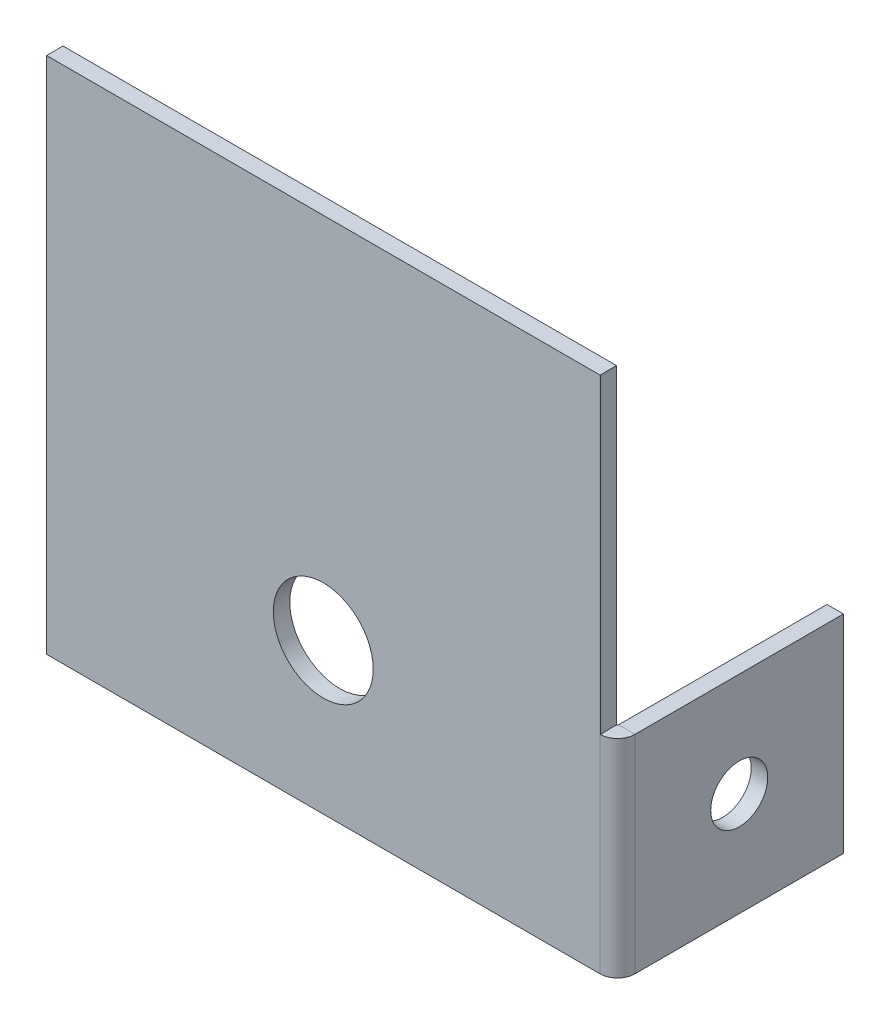
ISO-10303-21;
HEADER;
FILE_DESCRIPTION(('STEP AP214'),'2;1');
FILE_NAME('part.step','',(''),(''),'','','');
FILE_SCHEMA(('AUTOMOTIVE_DESIGN { 1 0 10303 214 1 1 1 1 }'));
ENDSEC;
DATA;
#1=APPLICATION_CONTEXT('core data for automotive mechanical design processes');
#2=APPLICATION_PROTOCOL_DEFINITION('international standard','automotive_design',2000,#1);
#3=PRODUCT_CONTEXT('',#1,'mechanical');
#4=PRODUCT('Part','Part','',(#3));
#5=PRODUCT_RELATED_PRODUCT_CATEGORY('part','',(#4));
#6=PRODUCT_DEFINITION_FORMATION('','',#4);
#7=PRODUCT_DEFINITION_CONTEXT('part definition',#1,'design');
#8=PRODUCT_DEFINITION('design','',#6,#7);
#9=PRODUCT_DEFINITION_SHAPE('','',#8);
#10=(LENGTH_UNIT() NAMED_UNIT(*) SI_UNIT(.MILLI.,.METRE.));
#11=(NAMED_UNIT(*) PLANE_ANGLE_UNIT() SI_UNIT($,.RADIAN.));
#12=(NAMED_UNIT(*) SI_UNIT($,.STERADIAN.) SOLID_ANGLE_UNIT());
#13=UNCERTAINTY_MEASURE_WITH_UNIT(LENGTH_MEASURE(1.E-05),#10,'distance_accuracy_value','');
#14=(GEOMETRIC_REPRESENTATION_CONTEXT(3) GLOBAL_UNCERTAINTY_ASSIGNED_CONTEXT((#13)) GLOBAL_UNIT_ASSIGNED_CONTEXT((#10,
#11,#12)) REPRESENTATION_CONTEXT('',''));
#15=CARTESIAN_POINT('',(0.,0.,0.));
#16=DIRECTION('',(0.,0.,1.));
#17=DIRECTION('',(1.,0.,0.));
#18=AXIS2_PLACEMENT_3D('',#15,#16,#17);
#19=CARTESIAN_POINT('',(26.7316212801133,-30.,8.2125));
#20=DIRECTION('',(0.,1.,0.));
#21=DIRECTION('',(1.,0.,0.));
#22=AXIS2_PLACEMENT_3D('',#19,#20,#21);
#23=PLANE('',#22);
#24=DIRECTION('',(0.,0.,1.));
#25=VECTOR('',#24,1.);
#26=CARTESIAN_POINT('',(26.7316212801133,-30.,8.2125));
#27=LINE('',#26,#25);
#28=CARTESIAN_POINT('',(26.7316212801132,-30.,-21.7875));
#29=VERTEX_POINT('',#28);
#30=CARTESIAN_POINT('',(26.7316212801132,-30.,-1.68749999999999));
#31=VERTEX_POINT('',#30);
#32=EDGE_CURVE('E194',#29,#31,#27,.T.);
#33=ORIENTED_EDGE('',*,*,#32,.T.);
#34=DIRECTION('',(1.,0.,0.));
#35=VECTOR('',#34,1.);
#36=CARTESIAN_POINT('',(26.7316212801132,-30.,-1.68749999999999));
#37=LINE('',#36,#35);
#38=CARTESIAN_POINT('',(28.3191212801132,-30.,-1.6875));
#39=VERTEX_POINT('',#38);
#40=EDGE_CURVE('E12',#31,#39,#37,.T.);
#41=ORIENTED_EDGE('',*,*,#40,.T.);
#42=DIRECTION('',(0.,0.,1.));
#43=VECTOR('',#42,1.);
#44=CARTESIAN_POINT('',(28.3191212801133,-30.,8.2125));
#45=LINE('',#44,#43);
#46=CARTESIAN_POINT('',(28.3191212801132,-30.,-21.7875));
#47=VERTEX_POINT('',#46);
#48=EDGE_CURVE('E59',#47,#39,#45,.T.);
#49=ORIENTED_EDGE('',*,*,#48,.F.);
#50=DIRECTION('',(1.,0.,0.));
#51=VECTOR('',#50,1.);
#52=CARTESIAN_POINT('',(26.7316212801132,-30.,-21.7875));
#53=LINE('',#52,#51);
#54=EDGE_CURVE('E198',#29,#47,#53,.T.);
#55=ORIENTED_EDGE('',*,*,#54,.F.);
#56=EDGE_LOOP('',(#33,#41,#49,#55));
#57=FACE_BOUND('',#56,.T.);
#58=ADVANCED_FACE('F43',(#57),#23,.T.);
#59=CARTESIAN_POINT('',(26.7316212801135,-50.,61.6757425602265));
#60=DIRECTION('',(0.,-1.,0.));
#61=DIRECTION('',(0.,0.,-1.));
#62=AXIS2_PLACEMENT_3D('',#59,#60,#61);
#63=PLANE('',#62);
#64=DIRECTION('',(0.,0.,-1.));
#65=VECTOR('',#64,1.);
#66=CARTESIAN_POINT('',(28.3191212801135,-50.,61.6757425602265));
#67=LINE('',#66,#65);
#68=CARTESIAN_POINT('',(28.3191212801132,-50.,-1.68750000000001));
#69=VERTEX_POINT('',#68);
#70=CARTESIAN_POINT('',(28.3191212801132,-50.,-21.7875));
#71=VERTEX_POINT('',#70);
#72=EDGE_CURVE('E66',#69,#71,#67,.T.);
#73=ORIENTED_EDGE('',*,*,#72,.F.);
#74=DIRECTION('',(-1.,0.,0.));
#75=VECTOR('',#74,1.);
#76=CARTESIAN_POINT('',(26.7316212801132,-50.,-1.6875));
#77=LINE('',#76,#75);
#78=CARTESIAN_POINT('',(26.7316212801132,-50.,-1.6875));
#79=VERTEX_POINT('',#78);
#80=EDGE_CURVE('E204',#69,#79,#77,.T.);
#81=ORIENTED_EDGE('',*,*,#80,.T.);
#82=DIRECTION('',(0.,0.,-1.));
#83=VECTOR('',#82,1.);
#84=CARTESIAN_POINT('',(26.7316212801135,-50.,61.6757425602265));
#85=LINE('',#84,#83);
#86=CARTESIAN_POINT('',(26.7316212801132,-50.,-21.7875));
#87=VERTEX_POINT('',#86);
#88=EDGE_CURVE('E195',#79,#87,#85,.T.);
#89=ORIENTED_EDGE('',*,*,#88,.T.);
#90=DIRECTION('',(1.,0.,0.));
#91=VECTOR('',#90,1.);
#92=CARTESIAN_POINT('',(26.7316212801132,-50.,-21.7875));
#93=LINE('',#92,#91);
#94=EDGE_CURVE('E201',#87,#71,#93,.T.);
#95=ORIENTED_EDGE('',*,*,#94,.T.);
#96=EDGE_LOOP('',(#73,#81,#89,#95));
#97=FACE_BOUND('',#96,.T.);
#98=ADVANCED_FACE('F212',(#97),#63,.T.);
#99=CARTESIAN_POINT('',(28.3191212801134,0.,34.9441212801132));
#100=DIRECTION('',(1.,0.,0.));
#101=DIRECTION('',(0.,0.,-1.));
#102=AXIS2_PLACEMENT_3D('',#99,#100,#101);
#103=PLANE('',#102);
#104=CARTESIAN_POINT('',(28.3191212801133,-40.,-11.7375));
#105=DIRECTION('',(-1.,0.,0.));
#106=DIRECTION('',(0.,0.,1.));
#107=AXIS2_PLACEMENT_3D('',#104,#105,#106);
#108=CIRCLE('',#107,2.75);
#109=CARTESIAN_POINT('',(28.3191212801133,-40.,-8.9875));
#110=VERTEX_POINT('',#109);
#111=EDGE_CURVE('E441',#110,#110,#108,.T.);
#112=ORIENTED_EDGE('',*,*,#111,.T.);
#113=EDGE_LOOP('',(#112));
#114=FACE_BOUND('',#113,.T.);
#115=ORIENTED_EDGE('',*,*,#48,.T.);
#116=DIRECTION('',(0.,-1.,0.));
#117=VECTOR('',#116,1.);
#118=CARTESIAN_POINT('',(28.3191212801132,0.,-1.68749999999999));
#119=LINE('',#118,#117);
#120=EDGE_CURVE('E51',#39,#69,#119,.T.);
#121=ORIENTED_EDGE('',*,*,#120,.T.);
#122=ORIENTED_EDGE('',*,*,#72,.T.);
#123=DIRECTION('',(0.,1.,0.));
#124=VECTOR('',#123,1.);
#125=CARTESIAN_POINT('',(28.3191212801132,-30.,-21.7875));
#126=LINE('',#125,#124);
#127=EDGE_CURVE('E196',#71,#47,#126,.T.);
#128=ORIENTED_EDGE('',*,*,#127,.T.);
#129=EDGE_LOOP('',(#115,#121,#122,#128));
#130=FACE_BOUND('',#129,.T.);
#131=ADVANCED_FACE('F223',(#114,#130),#103,.T.);
#132=CARTESIAN_POINT('',(26.7316212801132,-30.,-21.7875));
#133=DIRECTION('',(0.,0.,-1.));
#134=DIRECTION('',(-1.,0.,0.));
#135=AXIS2_PLACEMENT_3D('',#132,#133,#134);
#136=PLANE('',#135);
#137=ORIENTED_EDGE('',*,*,#127,.F.);
#138=ORIENTED_EDGE('',*,*,#94,.F.);
#139=DIRECTION('',(0.,1.,0.));
#140=VECTOR('',#139,1.);
#141=CARTESIAN_POINT('',(26.7316212801132,-30.,-21.7875));
#142=LINE('',#141,#140);
#143=EDGE_CURVE('E191',#87,#29,#142,.T.);
#144=ORIENTED_EDGE('',*,*,#143,.T.);
#145=ORIENTED_EDGE('',*,*,#54,.T.);
#146=EDGE_LOOP('',(#137,#138,#144,#145));
#147=FACE_BOUND('',#146,.T.);
#148=ADVANCED_FACE('F218',(#147),#136,.T.);
#149=CARTESIAN_POINT('',(26.7316212801134,0.,34.9441212801133));
#150=DIRECTION('',(1.,0.,0.));
#151=DIRECTION('',(0.,0.,-1.));
#152=AXIS2_PLACEMENT_3D('',#149,#150,#151);
#153=PLANE('',#152);
#154=CARTESIAN_POINT('',(26.7316212801132,-40.,-11.7375));
#155=DIRECTION('',(-1.,0.,0.));
#156=DIRECTION('',(0.,0.,1.));
#157=AXIS2_PLACEMENT_3D('',#154,#155,#156);
#158=CIRCLE('',#157,2.75);
#159=CARTESIAN_POINT('',(26.7316212801132,-40.,-8.9875));
#160=VERTEX_POINT('',#159);
#161=EDGE_CURVE('E444',#160,#160,#158,.T.);
#162=ORIENTED_EDGE('',*,*,#161,.F.);
#163=EDGE_LOOP('',(#162));
#164=FACE_BOUND('',#163,.T.);
#165=DIRECTION('',(0.,-1.,0.));
#166=VECTOR('',#165,1.);
#167=CARTESIAN_POINT('',(26.7316212801132,0.,-1.68749999999999));
#168=LINE('',#167,#166);
#169=EDGE_CURVE('E200',#31,#79,#168,.T.);
#170=ORIENTED_EDGE('',*,*,#169,.F.);
#171=ORIENTED_EDGE('',*,*,#32,.F.);
#172=ORIENTED_EDGE('',*,*,#143,.F.);
#173=ORIENTED_EDGE('',*,*,#88,.F.);
#174=EDGE_LOOP('',(#170,#171,#172,#173));
#175=FACE_BOUND('',#174,.T.);
#176=ADVANCED_FACE('F220',(#164,#175),#153,.F.);
#177=CARTESIAN_POINT('',(-26.7316212801132,0.,-1.5875));
#178=DIRECTION('',(-1.,0.,0.));
#179=DIRECTION('',(0.,-1.,0.));
#180=AXIS2_PLACEMENT_3D('',#177,#178,#179);
#181=PLANE('',#180);
#182=DIRECTION('',(0.,-1.,0.));
#183=VECTOR('',#182,1.);
#184=CARTESIAN_POINT('',(-26.7316212801132,0.,0.));
#185=LINE('',#184,#183);
#186=CARTESIAN_POINT('',(-26.7316212801132,0.,0.));
#187=VERTEX_POINT('',#186);
#188=CARTESIAN_POINT('',(-26.7316212801132,-50.,0.));
#189=VERTEX_POINT('',#188);
#190=EDGE_CURVE('E168',#187,#189,#185,.T.);
#191=ORIENTED_EDGE('',*,*,#190,.F.);
#192=DIRECTION('',(0.,0.,1.));
#193=VECTOR('',#192,1.);
#194=CARTESIAN_POINT('',(-26.7316212801132,0.,-1.5875));
#195=LINE('',#194,#193);
#196=CARTESIAN_POINT('',(-26.7316212801132,0.,-1.5875));
#197=VERTEX_POINT('',#196);
#198=EDGE_CURVE('E161',#197,#187,#195,.T.);
#199=ORIENTED_EDGE('',*,*,#198,.F.);
#200=DIRECTION('',(0.,-1.,0.));
#201=VECTOR('',#200,1.);
#202=CARTESIAN_POINT('',(-26.7316212801132,0.,-1.5875));
#203=LINE('',#202,#201);
#204=CARTESIAN_POINT('',(-26.7316212801132,-50.,-1.5875));
#205=VERTEX_POINT('',#204);
#206=EDGE_CURVE('E180',#197,#205,#203,.T.);
#207=ORIENTED_EDGE('',*,*,#206,.T.);
#208=DIRECTION('',(0.,0.,1.));
#209=VECTOR('',#208,1.);
#210=CARTESIAN_POINT('',(-26.7316212801132,-50.,-1.5875));
#211=LINE('',#210,#209);
#212=EDGE_CURVE('E178',#205,#189,#211,.T.);
#213=ORIENTED_EDGE('',*,*,#212,.T.);
#214=EDGE_LOOP('',(#191,#199,#207,#213));
#215=FACE_BOUND('',#214,.T.);
#216=ADVANCED_FACE('F251',(#215),#181,.T.);
#217=CARTESIAN_POINT('',(0.,0.,-1.5875));
#218=DIRECTION('',(0.,0.,1.));
#219=DIRECTION('',(1.,0.,0.));
#220=AXIS2_PLACEMENT_3D('',#217,#218,#219);
#221=PLANE('',#220);
#222=CARTESIAN_POINT('',(-0.0499999999999892,-35.5,-1.5875));
#223=DIRECTION('',(0.,0.,-1.));
#224=DIRECTION('',(-1.,0.,0.));
#225=AXIS2_PLACEMENT_3D('',#222,#223,#224);
#226=CIRCLE('',#225,4.815);
#227=CARTESIAN_POINT('',(-4.86499999999999,-35.5,-1.5875));
#228=VERTEX_POINT('',#227);
#229=EDGE_CURVE('E446',#228,#228,#226,.T.);
#230=ORIENTED_EDGE('',*,*,#229,.F.);
#231=EDGE_LOOP('',(#230));
#232=FACE_BOUND('',#231,.T.);
#233=DIRECTION('',(-1.,0.,0.));
#234=VECTOR('',#233,1.);
#235=CARTESIAN_POINT('',(26.7316212801132,0.,-1.5875));
#236=LINE('',#235,#234);
#237=CARTESIAN_POINT('',(26.6316212801132,0.,-1.5875));
#238=VERTEX_POINT('',#237);
#239=EDGE_CURVE('E164',#238,#197,#236,.T.);
#240=ORIENTED_EDGE('',*,*,#239,.F.);
#241=DIRECTION('',(0.,-1.,0.));
#242=VECTOR('',#241,1.);
#243=CARTESIAN_POINT('',(26.6316212801133,0.,-1.5875));
#244=LINE('',#243,#242);
#245=CARTESIAN_POINT('',(26.6316212801133,-50.,-1.5875));
#246=VERTEX_POINT('',#245);
#247=EDGE_CURVE('E175',#238,#246,#244,.T.);
#248=ORIENTED_EDGE('',*,*,#247,.T.);
#249=DIRECTION('',(1.,0.,0.));
#250=VECTOR('',#249,1.);
#251=CARTESIAN_POINT('',(-26.7316212801132,-50.,-1.5875));
#252=LINE('',#251,#250);
#253=EDGE_CURVE('E173',#205,#246,#252,.T.);
#254=ORIENTED_EDGE('',*,*,#253,.F.);
#255=ORIENTED_EDGE('',*,*,#206,.F.);
#256=EDGE_LOOP('',(#240,#248,#254,#255));
#257=FACE_BOUND('',#256,.T.);
#258=ADVANCED_FACE('F245',(#232,#257),#221,.F.);
#259=CARTESIAN_POINT('',(-26.7316212801132,-50.,-1.5875));
#260=DIRECTION('',(0.,-1.,0.));
#261=DIRECTION('',(1.,0.,0.));
#262=AXIS2_PLACEMENT_3D('',#259,#260,#261);
#263=PLANE('',#262);
#264=DIRECTION('',(0.,0.,-1.));
#265=VECTOR('',#264,1.);
#266=CARTESIAN_POINT('',(26.6316212801132,-50.,-1.5875));
#267=LINE('',#266,#265);
#268=CARTESIAN_POINT('',(26.6316212801133,-50.,0.));
#269=VERTEX_POINT('',#268);
#270=EDGE_CURVE('E183',#269,#246,#267,.T.);
#271=ORIENTED_EDGE('',*,*,#270,.F.);
#272=DIRECTION('',(1.,0.,0.));
#273=VECTOR('',#272,1.);
#274=CARTESIAN_POINT('',(-26.7316212801132,-50.,0.));
#275=LINE('',#274,#273);
#276=EDGE_CURVE('E166',#189,#269,#275,.T.);
#277=ORIENTED_EDGE('',*,*,#276,.F.);
#278=ORIENTED_EDGE('',*,*,#212,.F.);
#279=ORIENTED_EDGE('',*,*,#253,.T.);
#280=EDGE_LOOP('',(#271,#277,#278,#279));
#281=FACE_BOUND('',#280,.T.);
#282=ADVANCED_FACE('F248',(#281),#263,.T.);
#283=CARTESIAN_POINT('',(0.,0.,0.));
#284=DIRECTION('',(0.,0.,1.));
#285=DIRECTION('',(1.,0.,0.));
#286=AXIS2_PLACEMENT_3D('',#283,#284,#285);
#287=PLANE('',#286);
#288=CARTESIAN_POINT('',(-0.0499999999999892,-35.5,0.));
#289=DIRECTION('',(0.,0.,1.));
#290=DIRECTION('',(1.,0.,0.));
#291=AXIS2_PLACEMENT_3D('',#288,#289,#290);
#292=CIRCLE('',#291,4.815);
#293=CARTESIAN_POINT('',(4.76500000000001,-35.5,0.));
#294=VERTEX_POINT('',#293);
#295=EDGE_CURVE('E46',#294,#294,#292,.T.);
#296=ORIENTED_EDGE('',*,*,#295,.F.);
#297=EDGE_LOOP('',(#296));
#298=FACE_BOUND('',#297,.T.);
#299=DIRECTION('',(0.,-1.,0.));
#300=VECTOR('',#299,1.);
#301=CARTESIAN_POINT('',(26.6316212801133,0.,0.));
#302=LINE('',#301,#300);
#303=CARTESIAN_POINT('',(26.6316212801132,0.,0.));
#304=VERTEX_POINT('',#303);
#305=EDGE_CURVE('E186',#304,#269,#302,.T.);
#306=ORIENTED_EDGE('',*,*,#305,.F.);
#307=DIRECTION('',(-1.,0.,0.));
#308=VECTOR('',#307,1.);
#309=CARTESIAN_POINT('',(26.7316212801132,0.,0.));
#310=LINE('',#309,#308);
#311=EDGE_CURVE('E171',#304,#187,#310,.T.);
#312=ORIENTED_EDGE('',*,*,#311,.T.);
#313=ORIENTED_EDGE('',*,*,#190,.T.);
#314=ORIENTED_EDGE('',*,*,#276,.T.);
#315=EDGE_LOOP('',(#306,#312,#313,#314));
#316=FACE_BOUND('',#315,.T.);
#317=ADVANCED_FACE('F234',(#298,#316),#287,.T.);
#318=CARTESIAN_POINT('',(26.7316212801132,0.,-1.5875));
#319=DIRECTION('',(0.,1.,0.));
#320=DIRECTION('',(-1.,0.,0.));
#321=AXIS2_PLACEMENT_3D('',#318,#319,#320);
#322=PLANE('',#321);
#323=DIRECTION('',(0.,0.,1.));
#324=VECTOR('',#323,1.);
#325=CARTESIAN_POINT('',(26.6316212801133,0.,-1.5875));
#326=LINE('',#325,#324);
#327=EDGE_CURVE('E131',#238,#304,#326,.T.);
#328=ORIENTED_EDGE('',*,*,#327,.F.);
#329=ORIENTED_EDGE('',*,*,#239,.T.);
#330=ORIENTED_EDGE('',*,*,#198,.T.);
#331=ORIENTED_EDGE('',*,*,#311,.F.);
#332=EDGE_LOOP('',(#328,#329,#330,#331));
#333=FACE_BOUND('',#332,.T.);
#334=ADVANCED_FACE('F241',(#333),#322,.T.);
#335=CARTESIAN_POINT('',(26.6316212801132,-30.,-1.6875));
#336=DIRECTION('',(0.,-1.,0.));
#337=DIRECTION('',(0.,0.,-1.));
#338=AXIS2_PLACEMENT_3D('',#335,#336,#337);
#339=PLANE('',#338);
#340=DIRECTION('',(-0.0157073173119361,0.,-0.999876632481659));
#341=VECTOR('',#340,1.);
#342=CARTESIAN_POINT('',(26.6331920118444,-30.,-1.58751233675183));
#343=LINE('',#342,#341);
#344=CARTESIAN_POINT('',(26.6581273780771,-30.,-0.000208182687200676));
#345=VERTEX_POINT('',#344);
#346=CARTESIAN_POINT('',(26.6331920118444,-30.,-1.58751233675183));
#347=VERTEX_POINT('',#346);
#348=EDGE_CURVE('E121',#345,#347,#343,.T.);
#349=ORIENTED_EDGE('',*,*,#348,.F.);
#350=CARTESIAN_POINT('',(26.6316212801132,-30.,-1.6875));
#351=DIRECTION('',(0.,-1.,0.));
#352=DIRECTION('',(1.,0.,0.));
#353=AXIS2_PLACEMENT_3D('',#350,#351,#352);
#354=CIRCLE('',#353,1.6875);
#355=EDGE_CURVE('E158',#345,#39,#354,.F.);
#356=ORIENTED_EDGE('',*,*,#355,.T.);
#357=ORIENTED_EDGE('',*,*,#40,.F.);
#358=CARTESIAN_POINT('',(26.6316212801132,-30.,-1.6875));
#359=DIRECTION('',(0.,1.,0.));
#360=DIRECTION('',(0.,0.,-1.));
#361=AXIS2_PLACEMENT_3D('',#358,#359,#360);
#362=CIRCLE('',#361,0.0999999999999997);
#363=EDGE_CURVE('E136',#347,#31,#362,.T.);
#364=ORIENTED_EDGE('',*,*,#363,.F.);
#365=EDGE_LOOP('',(#349,#356,#357,#364));
#366=FACE_BOUND('',#365,.T.);
#367=ADVANCED_FACE('F137',(#366),#339,.F.);
#368=CARTESIAN_POINT('',(26.6316212801132,-50.,-1.6875));
#369=DIRECTION('',(0.,1.,0.));
#370=DIRECTION('',(0.,0.,1.));
#371=AXIS2_PLACEMENT_3D('',#368,#369,#370);
#372=PLANE('',#371);
#373=ORIENTED_EDGE('',*,*,#80,.F.);
#374=CARTESIAN_POINT('',(26.6316212801132,-50.,-1.6875));
#375=DIRECTION('',(0.,-1.,0.));
#376=DIRECTION('',(1.,0.,0.));
#377=AXIS2_PLACEMENT_3D('',#374,#375,#376);
#378=CIRCLE('',#377,1.6875);
#379=EDGE_CURVE('E155',#69,#269,#378,.T.);
#380=ORIENTED_EDGE('',*,*,#379,.T.);
#381=ORIENTED_EDGE('',*,*,#270,.T.);
#382=CARTESIAN_POINT('',(26.6316212801132,-50.,-1.6875));
#383=DIRECTION('',(0.,-1.,0.));
#384=DIRECTION('',(0.,0.,1.));
#385=AXIS2_PLACEMENT_3D('',#382,#383,#384);
#386=CIRCLE('',#385,0.0999999999999997);
#387=EDGE_CURVE('E140',#79,#246,#386,.T.);
#388=ORIENTED_EDGE('',*,*,#387,.F.);
#389=EDGE_LOOP('',(#373,#380,#381,#388));
#390=FACE_BOUND('',#389,.T.);
#391=ADVANCED_FACE('F228',(#390),#372,.F.);
#392=CARTESIAN_POINT('',(26.6316212801133,0.,-1.6875));
#393=DIRECTION('',(0.,-1.,0.));
#394=DIRECTION('',(1.,0.,0.));
#395=AXIS2_PLACEMENT_3D('',#392,#393,#394);
#396=PLANE('',#395);
#397=ORIENTED_EDGE('',*,*,#327,.T.);
#398=CARTESIAN_POINT('',(26.6316212801132,0.,-1.6875));
#399=DIRECTION('',(0.,-1.,0.));
#400=DIRECTION('',(1.,0.,0.));
#401=AXIS2_PLACEMENT_3D('',#398,#399,#400);
#402=CIRCLE('',#401,1.6875);
#403=CARTESIAN_POINT('',(26.6581273780772,0.,-0.000208182687200893));
#404=VERTEX_POINT('',#403);
#405=EDGE_CURVE('E152',#304,#404,#402,.F.);
#406=ORIENTED_EDGE('',*,*,#405,.T.);
#407=DIRECTION('',(-0.015707317311943,0.,-0.999876632481659));
#408=VECTOR('',#407,1.);
#409=CARTESIAN_POINT('',(26.6331920118444,0.,-1.58751233675183));
#410=LINE('',#409,#408);
#411=CARTESIAN_POINT('',(26.6331920118444,0.,-1.58751233675183));
#412=VERTEX_POINT('',#411);
#413=EDGE_CURVE('E132',#404,#412,#410,.T.);
#414=ORIENTED_EDGE('',*,*,#413,.T.);
#415=CARTESIAN_POINT('',(26.6316212801133,0.,-1.6875));
#416=DIRECTION('',(0.,1.,0.));
#417=DIRECTION('',(1.,0.,0.));
#418=AXIS2_PLACEMENT_3D('',#415,#416,#417);
#419=CIRCLE('',#418,0.1);
#420=EDGE_CURVE('E146',#238,#412,#419,.T.);
#421=ORIENTED_EDGE('',*,*,#420,.F.);
#422=EDGE_LOOP('',(#397,#406,#414,#421));
#423=FACE_BOUND('',#422,.T.);
#424=ADVANCED_FACE('F239',(#423),#396,.F.);
#425=CARTESIAN_POINT('',(26.6331920118444,-15.,-1.58751233675183));
#426=DIRECTION('',(-0.999876632481659,0.,0.0157073173119235));
#427=DIRECTION('',(0.,-1.,0.));
#428=AXIS2_PLACEMENT_3D('',#425,#426,#427);
#429=PLANE('',#428);
#430=DIRECTION('',(0.,-1.,0.));
#431=VECTOR('',#430,1.);
#432=CARTESIAN_POINT('',(26.6581273780772,26.014901315694,-0.000208182687200893));
#433=LINE('',#432,#431);
#434=EDGE_CURVE('E127',#404,#345,#433,.T.);
#435=ORIENTED_EDGE('',*,*,#434,.T.);
#436=ORIENTED_EDGE('',*,*,#348,.T.);
#437=DIRECTION('',(0.,-1.,0.));
#438=VECTOR('',#437,1.);
#439=CARTESIAN_POINT('',(26.6331920118444,-30.,-1.58751233675183));
#440=LINE('',#439,#438);
#441=EDGE_CURVE('E125',#412,#347,#440,.T.);
#442=ORIENTED_EDGE('',*,*,#441,.F.);
#443=ORIENTED_EDGE('',*,*,#413,.F.);
#444=EDGE_LOOP('',(#435,#436,#442,#443));
#445=FACE_BOUND('',#444,.T.);
#446=ADVANCED_FACE('F123',(#445),#429,.F.);
#447=CARTESIAN_POINT('',(26.6316212801133,26.014901315694,-1.6875));
#448=DIRECTION('',(0.,-1.,0.));
#449=DIRECTION('',(1.,0.,0.));
#450=AXIS2_PLACEMENT_3D('',#447,#448,#449);
#451=CYLINDRICAL_SURFACE('',#450,0.1);
#452=ORIENTED_EDGE('',*,*,#420,.T.);
#453=ORIENTED_EDGE('',*,*,#441,.T.);
#454=ORIENTED_EDGE('',*,*,#363,.T.);
#455=ORIENTED_EDGE('',*,*,#169,.T.);
#456=ORIENTED_EDGE('',*,*,#387,.T.);
#457=ORIENTED_EDGE('',*,*,#247,.F.);
#458=EDGE_LOOP('',(#452,#453,#454,#455,#456,#457));
#459=FACE_BOUND('',#458,.T.);
#460=ADVANCED_FACE('F143',(#459),#451,.F.);
#461=CARTESIAN_POINT('',(26.6316212801133,26.014901315694,-1.6875));
#462=DIRECTION('',(0.,-1.,0.));
#463=DIRECTION('',(1.,0.,0.));
#464=AXIS2_PLACEMENT_3D('',#461,#462,#463);
#465=CYLINDRICAL_SURFACE('',#464,1.6875);
#466=ORIENTED_EDGE('',*,*,#405,.F.);
#467=ORIENTED_EDGE('',*,*,#305,.T.);
#468=ORIENTED_EDGE('',*,*,#379,.F.);
#469=ORIENTED_EDGE('',*,*,#120,.F.);
#470=ORIENTED_EDGE('',*,*,#355,.F.);
#471=ORIENTED_EDGE('',*,*,#434,.F.);
#472=EDGE_LOOP('',(#466,#467,#468,#469,#470,#471));
#473=FACE_BOUND('',#472,.T.);
#474=ADVANCED_FACE('F231',(#473),#465,.T.);
#475=CARTESIAN_POINT('',(-0.0499999999999892,-35.5,8.4125));
#476=DIRECTION('',(0.,0.,-1.));
#477=DIRECTION('',(-1.,0.,0.));
#478=AXIS2_PLACEMENT_3D('',#475,#476,#477);
#479=CYLINDRICAL_SURFACE('',#478,4.815);
#480=ORIENTED_EDGE('',*,*,#295,.T.);
#481=EDGE_LOOP('',(#480));
#482=FACE_BOUND('',#481,.T.);
#483=ORIENTED_EDGE('',*,*,#229,.T.);
#484=EDGE_LOOP('',(#483));
#485=FACE_BOUND('',#484,.T.);
#486=ADVANCED_FACE('F329',(#482,#485),#479,.F.);
#487=CARTESIAN_POINT('',(28.3191212801133,-40.,-11.7375));
#488=DIRECTION('',(-1.,0.,0.));
#489=DIRECTION('',(0.,0.,1.));
#490=AXIS2_PLACEMENT_3D('',#487,#488,#489);
#491=CYLINDRICAL_SURFACE('',#490,2.75);
#492=ORIENTED_EDGE('',*,*,#111,.F.);
#493=EDGE_LOOP('',(#492));
#494=FACE_BOUND('',#493,.T.);
#495=ORIENTED_EDGE('',*,*,#161,.T.);
#496=EDGE_LOOP('',(#495));
#497=FACE_BOUND('',#496,.T.);
#498=ADVANCED_FACE('F335',(#494,#497),#491,.F.);
#499=CLOSED_SHELL('',(#58,#98,#131,#148,#176,#216,#258,#282,#317,#334,#367,#391,#424,#446,#460,
#474,#486,#498));
#500=MANIFOLD_SOLID_BREP('B2',#499);
#501=ADVANCED_BREP_SHAPE_REPRESENTATION('',(#18,#500),#14);
#502=SHAPE_DEFINITION_REPRESENTATION(#9,#501);
ENDSEC;
END-ISO-10303-21;
